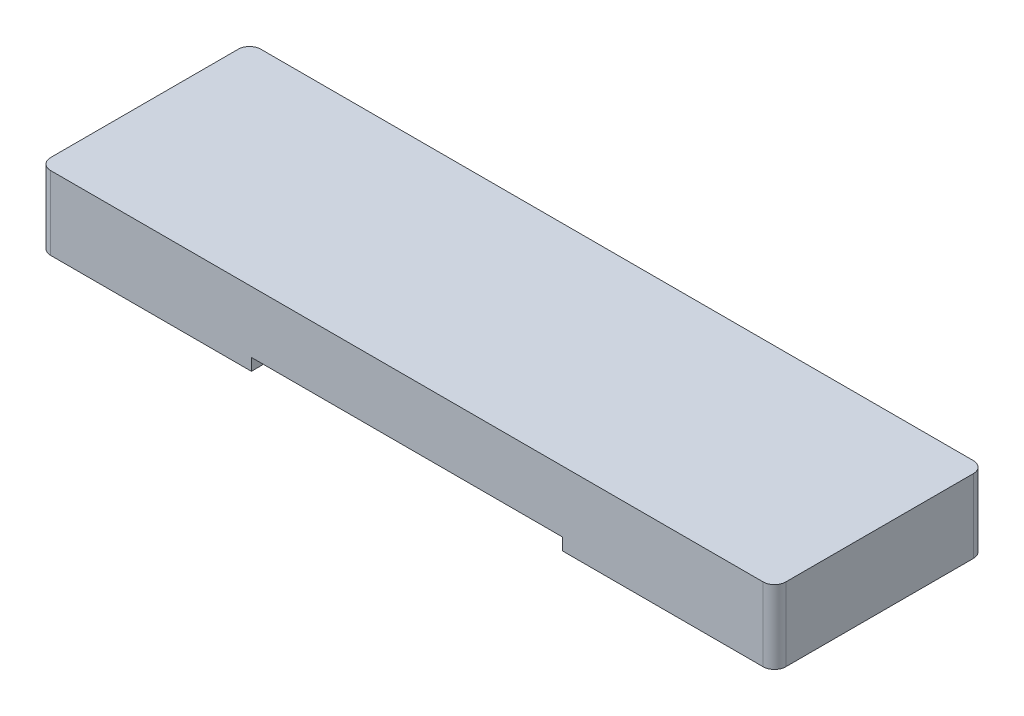
ISO-10303-21;
HEADER;
FILE_DESCRIPTION(('STEP AP214'),'2;1');
FILE_NAME('part.step','',(''),(''),'','','');
FILE_SCHEMA(('AUTOMOTIVE_DESIGN { 1 0 10303 214 1 1 1 1 }'));
ENDSEC;
DATA;
#1=APPLICATION_CONTEXT('core data for automotive mechanical design processes');
#2=APPLICATION_PROTOCOL_DEFINITION('international standard','automotive_design',2000,#1);
#3=PRODUCT_CONTEXT('',#1,'mechanical');
#4=PRODUCT('Part','Part','',(#3));
#5=PRODUCT_RELATED_PRODUCT_CATEGORY('part','',(#4));
#6=PRODUCT_DEFINITION_FORMATION('','',#4);
#7=PRODUCT_DEFINITION_CONTEXT('part definition',#1,'design');
#8=PRODUCT_DEFINITION('design','',#6,#7);
#9=PRODUCT_DEFINITION_SHAPE('','',#8);
#10=(LENGTH_UNIT() NAMED_UNIT(*) SI_UNIT(.MILLI.,.METRE.));
#11=(NAMED_UNIT(*) PLANE_ANGLE_UNIT() SI_UNIT($,.RADIAN.));
#12=(NAMED_UNIT(*) SI_UNIT($,.STERADIAN.) SOLID_ANGLE_UNIT());
#13=UNCERTAINTY_MEASURE_WITH_UNIT(LENGTH_MEASURE(1.E-05),#10,'distance_accuracy_value','');
#14=(GEOMETRIC_REPRESENTATION_CONTEXT(3) GLOBAL_UNCERTAINTY_ASSIGNED_CONTEXT((#13)) GLOBAL_UNIT_ASSIGNED_CONTEXT((#10,
#11,#12)) REPRESENTATION_CONTEXT('',''));
#15=CARTESIAN_POINT('',(0.,0.,0.));
#16=DIRECTION('',(0.,0.,1.));
#17=DIRECTION('',(1.,0.,0.));
#18=AXIS2_PLACEMENT_3D('',#15,#16,#17);
#19=CARTESIAN_POINT('',(0.,0.,-37.17));
#20=DIRECTION('',(0.,-1.,0.));
#21=DIRECTION('',(0.,0.,-1.));
#22=AXIS2_PLACEMENT_3D('',#19,#20,#21);
#23=PLANE('',#22);
#24=DIRECTION('',(0.,0.,1.));
#25=VECTOR('',#24,1.);
#26=CARTESIAN_POINT('',(0.,0.,-37.17));
#27=LINE('',#26,#25);
#28=CARTESIAN_POINT('',(0.,0.,-35.17));
#29=VERTEX_POINT('',#28);
#30=CARTESIAN_POINT('',(0.,0.,-2.));
#31=VERTEX_POINT('',#30);
#32=EDGE_CURVE('E222',#29,#31,#27,.T.);
#33=ORIENTED_EDGE('',*,*,#32,.F.);
#34=CARTESIAN_POINT('',(2.,0.,-35.17));
#35=DIRECTION('',(0.,-1.,0.));
#36=DIRECTION('',(0.,0.,-1.));
#37=AXIS2_PLACEMENT_3D('',#34,#35,#36);
#38=CIRCLE('',#37,2.);
#39=CARTESIAN_POINT('',(2.,0.,-37.17));
#40=VERTEX_POINT('',#39);
#41=EDGE_CURVE('E253',#29,#40,#38,.T.);
#42=ORIENTED_EDGE('',*,*,#41,.T.);
#43=DIRECTION('',(1.,0.,0.));
#44=VECTOR('',#43,1.);
#45=CARTESIAN_POINT('',(0.,0.,-37.17));
#46=LINE('',#45,#44);
#47=CARTESIAN_POINT('',(128.,0.,-37.17));
#48=VERTEX_POINT('',#47);
#49=EDGE_CURVE('E217',#40,#48,#46,.T.);
#50=ORIENTED_EDGE('',*,*,#49,.T.);
#51=CARTESIAN_POINT('',(128.,0.,-35.17));
#52=DIRECTION('',(0.,-1.,0.));
#53=DIRECTION('',(0.,0.,-1.));
#54=AXIS2_PLACEMENT_3D('',#51,#52,#53);
#55=CIRCLE('',#54,2.);
#56=CARTESIAN_POINT('',(130.,0.,-35.17));
#57=VERTEX_POINT('',#56);
#58=EDGE_CURVE('E249',#48,#57,#55,.T.);
#59=ORIENTED_EDGE('',*,*,#58,.T.);
#60=DIRECTION('',(0.,0.,1.));
#61=VECTOR('',#60,1.);
#62=CARTESIAN_POINT('',(130.,0.,-37.17));
#63=LINE('',#62,#61);
#64=CARTESIAN_POINT('',(130.,0.,-2.));
#65=VERTEX_POINT('',#64);
#66=EDGE_CURVE('E231',#57,#65,#63,.T.);
#67=ORIENTED_EDGE('',*,*,#66,.T.);
#68=CARTESIAN_POINT('',(128.,0.,-2.));
#69=DIRECTION('',(0.,-1.,0.));
#70=DIRECTION('',(0.,0.,-1.));
#71=AXIS2_PLACEMENT_3D('',#68,#69,#70);
#72=CIRCLE('',#71,2.);
#73=CARTESIAN_POINT('',(128.,0.,0.));
#74=VERTEX_POINT('',#73);
#75=EDGE_CURVE('E247',#65,#74,#72,.T.);
#76=ORIENTED_EDGE('',*,*,#75,.T.);
#77=DIRECTION('',(1.,0.,0.));
#78=VECTOR('',#77,1.);
#79=CARTESIAN_POINT('',(0.,0.,0.));
#80=LINE('',#79,#78);
#81=CARTESIAN_POINT('',(92.5,0.,0.));
#82=VERTEX_POINT('',#81);
#83=EDGE_CURVE('E163',#82,#74,#80,.T.);
#84=ORIENTED_EDGE('',*,*,#83,.F.);
#85=DIRECTION('',(0.,0.,1.));
#86=VECTOR('',#85,1.);
#87=CARTESIAN_POINT('',(92.5,0.,-5.));
#88=LINE('',#87,#86);
#89=CARTESIAN_POINT('',(92.5,0.,-2.));
#90=VERTEX_POINT('',#89);
#91=EDGE_CURVE('E178',#90,#82,#88,.T.);
#92=ORIENTED_EDGE('',*,*,#91,.F.);
#93=DIRECTION('',(1.,0.,0.));
#94=VECTOR('',#93,1.);
#95=CARTESIAN_POINT('',(0.,0.,-2.));
#96=LINE('',#95,#94);
#97=CARTESIAN_POINT('',(128.,0.,-2.));
#98=VERTEX_POINT('',#97);
#99=EDGE_CURVE('E189',#90,#98,#96,.T.);
#100=ORIENTED_EDGE('',*,*,#99,.T.);
#101=DIRECTION('',(0.,0.,1.));
#102=VECTOR('',#101,1.);
#103=CARTESIAN_POINT('',(128.,0.,-37.17));
#104=LINE('',#103,#102);
#105=CARTESIAN_POINT('',(128.,0.,-35.17));
#106=VERTEX_POINT('',#105);
#107=EDGE_CURVE('E202',#106,#98,#104,.T.);
#108=ORIENTED_EDGE('',*,*,#107,.F.);
#109=DIRECTION('',(1.,0.,0.));
#110=VECTOR('',#109,1.);
#111=CARTESIAN_POINT('',(0.,0.,-35.17));
#112=LINE('',#111,#110);
#113=CARTESIAN_POINT('',(2.,0.,-35.17));
#114=VERTEX_POINT('',#113);
#115=EDGE_CURVE('E196',#114,#106,#112,.T.);
#116=ORIENTED_EDGE('',*,*,#115,.F.);
#117=DIRECTION('',(0.,0.,1.));
#118=VECTOR('',#117,1.);
#119=CARTESIAN_POINT('',(2.,0.,-37.17));
#120=LINE('',#119,#118);
#121=CARTESIAN_POINT('',(2.,0.,-2.));
#122=VERTEX_POINT('',#121);
#123=EDGE_CURVE('E206',#114,#122,#120,.T.);
#124=ORIENTED_EDGE('',*,*,#123,.T.);
#125=CARTESIAN_POINT('',(37.5,0.,-2.));
#126=VERTEX_POINT('',#125);
#127=EDGE_CURVE('E177',#122,#126,#96,.T.);
#128=ORIENTED_EDGE('',*,*,#127,.T.);
#129=DIRECTION('',(0.,0.,1.));
#130=VECTOR('',#129,1.);
#131=CARTESIAN_POINT('',(37.5,0.,-5.));
#132=LINE('',#131,#130);
#133=CARTESIAN_POINT('',(37.5,0.,0.));
#134=VERTEX_POINT('',#133);
#135=EDGE_CURVE('E167',#126,#134,#132,.T.);
#136=ORIENTED_EDGE('',*,*,#135,.T.);
#137=CARTESIAN_POINT('',(2.,0.,0.));
#138=VERTEX_POINT('',#137);
#139=EDGE_CURVE('E152',#138,#134,#80,.T.);
#140=ORIENTED_EDGE('',*,*,#139,.F.);
#141=CARTESIAN_POINT('',(2.,0.,-2.));
#142=DIRECTION('',(0.,-1.,0.));
#143=DIRECTION('',(0.,0.,-1.));
#144=AXIS2_PLACEMENT_3D('',#141,#142,#143);
#145=CIRCLE('',#144,2.);
#146=EDGE_CURVE('E251',#138,#31,#145,.T.);
#147=ORIENTED_EDGE('',*,*,#146,.T.);
#148=EDGE_LOOP('',(#33,#42,#50,#59,#67,#76,#84,#92,#100,#108,#116,#124,#128,#136,#140,#147));
#149=FACE_BOUND('',#148,.T.);
#150=ADVANCED_FACE('F37',(#149),#23,.T.);
#151=CARTESIAN_POINT('',(0.,0.,-37.17));
#152=DIRECTION('',(-1.,0.,0.));
#153=DIRECTION('',(0.,0.,1.));
#154=AXIS2_PLACEMENT_3D('',#151,#152,#153);
#155=PLANE('',#154);
#156=DIRECTION('',(0.,0.,1.));
#157=VECTOR('',#156,1.);
#158=CARTESIAN_POINT('',(0.,13.,-37.17));
#159=LINE('',#158,#157);
#160=CARTESIAN_POINT('',(0.,13.,-35.17));
#161=VERTEX_POINT('',#160);
#162=CARTESIAN_POINT('',(0.,13.,-2.));
#163=VERTEX_POINT('',#162);
#164=EDGE_CURVE('E225',#161,#163,#159,.T.);
#165=ORIENTED_EDGE('',*,*,#164,.F.);
#166=DIRECTION('',(0.,-1.,0.));
#167=VECTOR('',#166,1.);
#168=CARTESIAN_POINT('',(0.,0.,-35.17));
#169=LINE('',#168,#167);
#170=EDGE_CURVE('E244',#161,#29,#169,.T.);
#171=ORIENTED_EDGE('',*,*,#170,.T.);
#172=ORIENTED_EDGE('',*,*,#32,.T.);
#173=DIRECTION('',(0.,-1.,0.));
#174=VECTOR('',#173,1.);
#175=CARTESIAN_POINT('',(0.,13.,-2.));
#176=LINE('',#175,#174);
#177=EDGE_CURVE('E242',#31,#163,#176,.F.);
#178=ORIENTED_EDGE('',*,*,#177,.T.);
#179=EDGE_LOOP('',(#165,#171,#172,#178));
#180=FACE_BOUND('',#179,.T.);
#181=ADVANCED_FACE('F286',(#180),#155,.T.);
#182=CARTESIAN_POINT('',(0.,13.,-37.17));
#183=DIRECTION('',(0.,1.,0.));
#184=DIRECTION('',(0.,0.,1.));
#185=AXIS2_PLACEMENT_3D('',#182,#183,#184);
#186=PLANE('',#185);
#187=DIRECTION('',(-1.,0.,0.));
#188=VECTOR('',#187,1.);
#189=CARTESIAN_POINT('',(0.,13.,-37.17));
#190=LINE('',#189,#188);
#191=CARTESIAN_POINT('',(128.,13.,-37.17));
#192=VERTEX_POINT('',#191);
#193=CARTESIAN_POINT('',(2.,13.,-37.17));
#194=VERTEX_POINT('',#193);
#195=EDGE_CURVE('E220',#192,#194,#190,.T.);
#196=ORIENTED_EDGE('',*,*,#195,.T.);
#197=CARTESIAN_POINT('',(2.,13.,-35.17));
#198=DIRECTION('',(0.,1.,0.));
#199=DIRECTION('',(0.,0.,1.));
#200=AXIS2_PLACEMENT_3D('',#197,#198,#199);
#201=CIRCLE('',#200,2.);
#202=EDGE_CURVE('E263',#194,#161,#201,.T.);
#203=ORIENTED_EDGE('',*,*,#202,.T.);
#204=ORIENTED_EDGE('',*,*,#164,.T.);
#205=CARTESIAN_POINT('',(2.,13.,-2.));
#206=DIRECTION('',(0.,1.,0.));
#207=DIRECTION('',(0.,0.,1.));
#208=AXIS2_PLACEMENT_3D('',#205,#206,#207);
#209=CIRCLE('',#208,2.);
#210=CARTESIAN_POINT('',(2.,13.,0.));
#211=VERTEX_POINT('',#210);
#212=EDGE_CURVE('E261',#163,#211,#209,.T.);
#213=ORIENTED_EDGE('',*,*,#212,.T.);
#214=DIRECTION('',(-1.,0.,0.));
#215=VECTOR('',#214,1.);
#216=CARTESIAN_POINT('',(0.,13.,0.));
#217=LINE('',#216,#215);
#218=CARTESIAN_POINT('',(128.,13.,0.));
#219=VERTEX_POINT('',#218);
#220=EDGE_CURVE('E162',#219,#211,#217,.T.);
#221=ORIENTED_EDGE('',*,*,#220,.F.);
#222=CARTESIAN_POINT('',(128.,13.,-2.));
#223=DIRECTION('',(0.,1.,0.));
#224=DIRECTION('',(0.,0.,1.));
#225=AXIS2_PLACEMENT_3D('',#222,#223,#224);
#226=CIRCLE('',#225,2.);
#227=CARTESIAN_POINT('',(130.,13.,-2.));
#228=VERTEX_POINT('',#227);
#229=EDGE_CURVE('E52',#219,#228,#226,.T.);
#230=ORIENTED_EDGE('',*,*,#229,.T.);
#231=DIRECTION('',(0.,0.,1.));
#232=VECTOR('',#231,1.);
#233=CARTESIAN_POINT('',(130.,13.,-37.17));
#234=LINE('',#233,#232);
#235=CARTESIAN_POINT('',(130.,13.,-35.17));
#236=VERTEX_POINT('',#235);
#237=EDGE_CURVE('E229',#236,#228,#234,.T.);
#238=ORIENTED_EDGE('',*,*,#237,.F.);
#239=CARTESIAN_POINT('',(128.,13.,-35.17));
#240=DIRECTION('',(0.,1.,0.));
#241=DIRECTION('',(0.,0.,1.));
#242=AXIS2_PLACEMENT_3D('',#239,#240,#241);
#243=CIRCLE('',#242,2.);
#244=EDGE_CURVE('E60',#236,#192,#243,.T.);
#245=ORIENTED_EDGE('',*,*,#244,.T.);
#246=EDGE_LOOP('',(#196,#203,#204,#213,#221,#230,#238,#245));
#247=FACE_BOUND('',#246,.T.);
#248=ADVANCED_FACE('F279',(#247),#186,.T.);
#249=CARTESIAN_POINT('',(130.,13.,-37.17));
#250=DIRECTION('',(1.,0.,0.));
#251=DIRECTION('',(0.,0.,-1.));
#252=AXIS2_PLACEMENT_3D('',#249,#250,#251);
#253=PLANE('',#252);
#254=ORIENTED_EDGE('',*,*,#66,.F.);
#255=DIRECTION('',(0.,1.,0.));
#256=VECTOR('',#255,1.);
#257=CARTESIAN_POINT('',(130.,13.,-35.17));
#258=LINE('',#257,#256);
#259=EDGE_CURVE('E11',#57,#236,#258,.T.);
#260=ORIENTED_EDGE('',*,*,#259,.T.);
#261=ORIENTED_EDGE('',*,*,#237,.T.);
#262=DIRECTION('',(0.,1.,0.));
#263=VECTOR('',#262,1.);
#264=CARTESIAN_POINT('',(130.,0.,-2.));
#265=LINE('',#264,#263);
#266=EDGE_CURVE('E45',#228,#65,#265,.F.);
#267=ORIENTED_EDGE('',*,*,#266,.T.);
#268=EDGE_LOOP('',(#254,#260,#261,#267));
#269=FACE_BOUND('',#268,.T.);
#270=ADVANCED_FACE('F271',(#269),#253,.T.);
#271=CARTESIAN_POINT('',(0.,0.,-37.17));
#272=DIRECTION('',(0.,0.,-1.));
#273=DIRECTION('',(-1.,0.,0.));
#274=AXIS2_PLACEMENT_3D('',#271,#272,#273);
#275=PLANE('',#274);
#276=ORIENTED_EDGE('',*,*,#49,.F.);
#277=DIRECTION('',(0.,-1.,0.));
#278=VECTOR('',#277,1.);
#279=CARTESIAN_POINT('',(2.,0.,-37.17));
#280=LINE('',#279,#278);
#281=EDGE_CURVE('E257',#40,#194,#280,.F.);
#282=ORIENTED_EDGE('',*,*,#281,.T.);
#283=ORIENTED_EDGE('',*,*,#195,.F.);
#284=DIRECTION('',(0.,1.,0.));
#285=VECTOR('',#284,1.);
#286=CARTESIAN_POINT('',(128.,0.,-37.17));
#287=LINE('',#286,#285);
#288=EDGE_CURVE('E255',#192,#48,#287,.F.);
#289=ORIENTED_EDGE('',*,*,#288,.T.);
#290=EDGE_LOOP('',(#276,#282,#283,#289));
#291=FACE_BOUND('',#290,.T.);
#292=ADVANCED_FACE('F294',(#291),#275,.T.);
#293=CARTESIAN_POINT('',(0.,0.,0.));
#294=DIRECTION('',(0.,0.,-1.));
#295=DIRECTION('',(-1.,0.,0.));
#296=AXIS2_PLACEMENT_3D('',#293,#294,#295);
#297=PLANE('',#296);
#298=ORIENTED_EDGE('',*,*,#220,.T.);
#299=DIRECTION('',(0.,-1.,0.));
#300=VECTOR('',#299,1.);
#301=CARTESIAN_POINT('',(2.,0.,0.));
#302=LINE('',#301,#300);
#303=EDGE_CURVE('E159',#211,#138,#302,.T.);
#304=ORIENTED_EDGE('',*,*,#303,.T.);
#305=ORIENTED_EDGE('',*,*,#139,.T.);
#306=DIRECTION('',(0.,-1.,0.));
#307=VECTOR('',#306,1.);
#308=CARTESIAN_POINT('',(37.5,0.,0.));
#309=LINE('',#308,#307);
#310=CARTESIAN_POINT('',(37.5,2.13378228,0.));
#311=VERTEX_POINT('',#310);
#312=EDGE_CURVE('E157',#311,#134,#309,.T.);
#313=ORIENTED_EDGE('',*,*,#312,.F.);
#314=DIRECTION('',(-1.,0.,0.));
#315=VECTOR('',#314,1.);
#316=CARTESIAN_POINT('',(37.5,2.13378228,0.));
#317=LINE('',#316,#315);
#318=CARTESIAN_POINT('',(92.5,2.13378228,0.));
#319=VERTEX_POINT('',#318);
#320=EDGE_CURVE('E179',#319,#311,#317,.T.);
#321=ORIENTED_EDGE('',*,*,#320,.F.);
#322=DIRECTION('',(0.,1.,0.));
#323=VECTOR('',#322,1.);
#324=CARTESIAN_POINT('',(92.5,0.,0.));
#325=LINE('',#324,#323);
#326=EDGE_CURVE('E172',#82,#319,#325,.T.);
#327=ORIENTED_EDGE('',*,*,#326,.F.);
#328=ORIENTED_EDGE('',*,*,#83,.T.);
#329=DIRECTION('',(0.,1.,0.));
#330=VECTOR('',#329,1.);
#331=CARTESIAN_POINT('',(128.,13.,0.));
#332=LINE('',#331,#330);
#333=EDGE_CURVE('E265',#74,#219,#332,.T.);
#334=ORIENTED_EDGE('',*,*,#333,.T.);
#335=EDGE_LOOP('',(#298,#304,#305,#313,#321,#327,#328,#334));
#336=FACE_BOUND('',#335,.T.);
#337=ADVANCED_FACE('F155',(#336),#297,.F.);
#338=CARTESIAN_POINT('',(2.,0.,-37.17));
#339=DIRECTION('',(-1.,0.,0.));
#340=DIRECTION('',(0.,0.,1.));
#341=AXIS2_PLACEMENT_3D('',#338,#339,#340);
#342=PLANE('',#341);
#343=DIRECTION('',(0.,-1.,0.));
#344=VECTOR('',#343,1.);
#345=CARTESIAN_POINT('',(2.,0.,-2.));
#346=LINE('',#345,#344);
#347=CARTESIAN_POINT('',(2.,11.,-2.));
#348=VERTEX_POINT('',#347);
#349=EDGE_CURVE('E186',#348,#122,#346,.T.);
#350=ORIENTED_EDGE('',*,*,#349,.T.);
#351=ORIENTED_EDGE('',*,*,#123,.F.);
#352=DIRECTION('',(0.,-1.,0.));
#353=VECTOR('',#352,1.);
#354=CARTESIAN_POINT('',(2.,0.,-35.17));
#355=LINE('',#354,#353);
#356=CARTESIAN_POINT('',(2.,11.,-35.17));
#357=VERTEX_POINT('',#356);
#358=EDGE_CURVE('E193',#357,#114,#355,.T.);
#359=ORIENTED_EDGE('',*,*,#358,.F.);
#360=DIRECTION('',(0.,0.,1.));
#361=VECTOR('',#360,1.);
#362=CARTESIAN_POINT('',(2.,11.,-37.17));
#363=LINE('',#362,#361);
#364=EDGE_CURVE('E190',#357,#348,#363,.T.);
#365=ORIENTED_EDGE('',*,*,#364,.T.);
#366=EDGE_LOOP('',(#350,#351,#359,#365));
#367=FACE_BOUND('',#366,.T.);
#368=ADVANCED_FACE('F329',(#367),#342,.F.);
#369=CARTESIAN_POINT('',(0.,11.,-37.17));
#370=DIRECTION('',(0.,1.,0.));
#371=DIRECTION('',(0.,0.,1.));
#372=AXIS2_PLACEMENT_3D('',#369,#370,#371);
#373=PLANE('',#372);
#374=DIRECTION('',(-1.,0.,0.));
#375=VECTOR('',#374,1.);
#376=CARTESIAN_POINT('',(0.,11.,-2.));
#377=LINE('',#376,#375);
#378=CARTESIAN_POINT('',(128.,11.,-2.));
#379=VERTEX_POINT('',#378);
#380=EDGE_CURVE('E197',#379,#348,#377,.T.);
#381=ORIENTED_EDGE('',*,*,#380,.T.);
#382=ORIENTED_EDGE('',*,*,#364,.F.);
#383=DIRECTION('',(-1.,0.,0.));
#384=VECTOR('',#383,1.);
#385=CARTESIAN_POINT('',(0.,11.,-35.17));
#386=LINE('',#385,#384);
#387=CARTESIAN_POINT('',(128.,11.,-35.17));
#388=VERTEX_POINT('',#387);
#389=EDGE_CURVE('E203',#388,#357,#386,.T.);
#390=ORIENTED_EDGE('',*,*,#389,.F.);
#391=DIRECTION('',(0.,0.,1.));
#392=VECTOR('',#391,1.);
#393=CARTESIAN_POINT('',(128.,11.,-37.17));
#394=LINE('',#393,#392);
#395=EDGE_CURVE('E192',#388,#379,#394,.T.);
#396=ORIENTED_EDGE('',*,*,#395,.T.);
#397=EDGE_LOOP('',(#381,#382,#390,#396));
#398=FACE_BOUND('',#397,.T.);
#399=ADVANCED_FACE('F332',(#398),#373,.F.);
#400=CARTESIAN_POINT('',(128.,13.,-37.17));
#401=DIRECTION('',(1.,0.,0.));
#402=DIRECTION('',(0.,0.,-1.));
#403=AXIS2_PLACEMENT_3D('',#400,#401,#402);
#404=PLANE('',#403);
#405=DIRECTION('',(0.,1.,0.));
#406=VECTOR('',#405,1.);
#407=CARTESIAN_POINT('',(128.,13.,-2.));
#408=LINE('',#407,#406);
#409=EDGE_CURVE('E200',#98,#379,#408,.T.);
#410=ORIENTED_EDGE('',*,*,#409,.T.);
#411=ORIENTED_EDGE('',*,*,#395,.F.);
#412=DIRECTION('',(0.,1.,0.));
#413=VECTOR('',#412,1.);
#414=CARTESIAN_POINT('',(128.,13.,-35.17));
#415=LINE('',#414,#413);
#416=EDGE_CURVE('E207',#106,#388,#415,.T.);
#417=ORIENTED_EDGE('',*,*,#416,.F.);
#418=ORIENTED_EDGE('',*,*,#107,.T.);
#419=EDGE_LOOP('',(#410,#411,#417,#418));
#420=FACE_BOUND('',#419,.T.);
#421=ADVANCED_FACE('F336',(#420),#404,.F.);
#422=CARTESIAN_POINT('',(0.,0.,-35.17));
#423=DIRECTION('',(0.,0.,-1.));
#424=DIRECTION('',(-1.,0.,0.));
#425=AXIS2_PLACEMENT_3D('',#422,#423,#424);
#426=PLANE('',#425);
#427=ORIENTED_EDGE('',*,*,#358,.T.);
#428=ORIENTED_EDGE('',*,*,#115,.T.);
#429=ORIENTED_EDGE('',*,*,#416,.T.);
#430=ORIENTED_EDGE('',*,*,#389,.T.);
#431=EDGE_LOOP('',(#427,#428,#429,#430));
#432=FACE_BOUND('',#431,.T.);
#433=ADVANCED_FACE('F340',(#432),#426,.F.);
#434=CARTESIAN_POINT('',(0.,0.,-2.));
#435=DIRECTION('',(0.,0.,-1.));
#436=DIRECTION('',(-1.,0.,0.));
#437=AXIS2_PLACEMENT_3D('',#434,#435,#436);
#438=PLANE('',#437);
#439=DIRECTION('',(0.,1.,0.));
#440=VECTOR('',#439,1.);
#441=CARTESIAN_POINT('',(37.5,0.,-2.));
#442=LINE('',#441,#440);
#443=CARTESIAN_POINT('',(37.5,2.13378228,-2.));
#444=VERTEX_POINT('',#443);
#445=EDGE_CURVE('E240',#126,#444,#442,.T.);
#446=ORIENTED_EDGE('',*,*,#445,.F.);
#447=ORIENTED_EDGE('',*,*,#127,.F.);
#448=ORIENTED_EDGE('',*,*,#349,.F.);
#449=ORIENTED_EDGE('',*,*,#380,.F.);
#450=ORIENTED_EDGE('',*,*,#409,.F.);
#451=ORIENTED_EDGE('',*,*,#99,.F.);
#452=DIRECTION('',(0.,-1.,0.));
#453=VECTOR('',#452,1.);
#454=CARTESIAN_POINT('',(92.5,0.,-2.));
#455=LINE('',#454,#453);
#456=CARTESIAN_POINT('',(92.5,2.13378228,-2.));
#457=VERTEX_POINT('',#456);
#458=EDGE_CURVE('E228',#457,#90,#455,.T.);
#459=ORIENTED_EDGE('',*,*,#458,.F.);
#460=DIRECTION('',(1.,0.,0.));
#461=VECTOR('',#460,1.);
#462=CARTESIAN_POINT('',(0.,2.13378228,-2.));
#463=LINE('',#462,#461);
#464=EDGE_CURVE('E237',#444,#457,#463,.T.);
#465=ORIENTED_EDGE('',*,*,#464,.F.);
#466=EDGE_LOOP('',(#446,#447,#448,#449,#450,#451,#459,#465));
#467=FACE_BOUND('',#466,.T.);
#468=ADVANCED_FACE('F328',(#467),#438,.T.);
#469=CARTESIAN_POINT('',(37.5,0.,-5.));
#470=DIRECTION('',(-1.,0.,0.));
#471=DIRECTION('',(0.,0.,1.));
#472=AXIS2_PLACEMENT_3D('',#469,#470,#471);
#473=PLANE('',#472);
#474=ORIENTED_EDGE('',*,*,#445,.T.);
#475=DIRECTION('',(0.,0.,1.));
#476=VECTOR('',#475,1.);
#477=CARTESIAN_POINT('',(37.5,2.13378228,-5.));
#478=LINE('',#477,#476);
#479=EDGE_CURVE('E170',#444,#311,#478,.T.);
#480=ORIENTED_EDGE('',*,*,#479,.T.);
#481=ORIENTED_EDGE('',*,*,#312,.T.);
#482=ORIENTED_EDGE('',*,*,#135,.F.);
#483=EDGE_LOOP('',(#474,#480,#481,#482));
#484=FACE_BOUND('',#483,.T.);
#485=ADVANCED_FACE('F166',(#484),#473,.F.);
#486=CARTESIAN_POINT('',(37.5,2.13378228,-5.));
#487=DIRECTION('',(0.,1.,0.));
#488=DIRECTION('',(0.,0.,1.));
#489=AXIS2_PLACEMENT_3D('',#486,#487,#488);
#490=PLANE('',#489);
#491=ORIENTED_EDGE('',*,*,#464,.T.);
#492=DIRECTION('',(0.,0.,1.));
#493=VECTOR('',#492,1.);
#494=CARTESIAN_POINT('',(92.5,2.13378228,-5.));
#495=LINE('',#494,#493);
#496=EDGE_CURVE('E181',#457,#319,#495,.T.);
#497=ORIENTED_EDGE('',*,*,#496,.T.);
#498=ORIENTED_EDGE('',*,*,#320,.T.);
#499=ORIENTED_EDGE('',*,*,#479,.F.);
#500=EDGE_LOOP('',(#491,#497,#498,#499));
#501=FACE_BOUND('',#500,.T.);
#502=ADVANCED_FACE('F318',(#501),#490,.F.);
#503=CARTESIAN_POINT('',(92.5,0.,-5.));
#504=DIRECTION('',(1.,0.,0.));
#505=DIRECTION('',(0.,0.,-1.));
#506=AXIS2_PLACEMENT_3D('',#503,#504,#505);
#507=PLANE('',#506);
#508=ORIENTED_EDGE('',*,*,#458,.T.);
#509=ORIENTED_EDGE('',*,*,#91,.T.);
#510=ORIENTED_EDGE('',*,*,#326,.T.);
#511=ORIENTED_EDGE('',*,*,#496,.F.);
#512=EDGE_LOOP('',(#508,#509,#510,#511));
#513=FACE_BOUND('',#512,.T.);
#514=ADVANCED_FACE('F314',(#513),#507,.F.);
#515=CARTESIAN_POINT('',(2.,0.,-35.17));
#516=DIRECTION('',(0.,-1.,0.));
#517=DIRECTION('',(0.,0.,-1.));
#518=AXIS2_PLACEMENT_3D('',#515,#516,#517);
#519=CYLINDRICAL_SURFACE('',#518,2.);
#520=ORIENTED_EDGE('',*,*,#202,.F.);
#521=ORIENTED_EDGE('',*,*,#281,.F.);
#522=ORIENTED_EDGE('',*,*,#41,.F.);
#523=ORIENTED_EDGE('',*,*,#170,.F.);
#524=EDGE_LOOP('',(#520,#521,#522,#523));
#525=FACE_BOUND('',#524,.T.);
#526=ADVANCED_FACE('F290',(#525),#519,.T.);
#527=CARTESIAN_POINT('',(2.,0.,-2.));
#528=DIRECTION('',(0.,1.,0.));
#529=DIRECTION('',(0.,0.,1.));
#530=AXIS2_PLACEMENT_3D('',#527,#528,#529);
#531=CYLINDRICAL_SURFACE('',#530,2.);
#532=ORIENTED_EDGE('',*,*,#212,.F.);
#533=ORIENTED_EDGE('',*,*,#177,.F.);
#534=ORIENTED_EDGE('',*,*,#146,.F.);
#535=ORIENTED_EDGE('',*,*,#303,.F.);
#536=EDGE_LOOP('',(#532,#533,#534,#535));
#537=FACE_BOUND('',#536,.T.);
#538=ADVANCED_FACE('F284',(#537),#531,.T.);
#539=CARTESIAN_POINT('',(128.,13.,-35.17));
#540=DIRECTION('',(0.,1.,0.));
#541=DIRECTION('',(0.,0.,1.));
#542=AXIS2_PLACEMENT_3D('',#539,#540,#541);
#543=CYLINDRICAL_SURFACE('',#542,2.);
#544=ORIENTED_EDGE('',*,*,#58,.F.);
#545=ORIENTED_EDGE('',*,*,#288,.F.);
#546=ORIENTED_EDGE('',*,*,#244,.F.);
#547=ORIENTED_EDGE('',*,*,#259,.F.);
#548=EDGE_LOOP('',(#544,#545,#546,#547));
#549=FACE_BOUND('',#548,.T.);
#550=ADVANCED_FACE('F296',(#549),#543,.T.);
#551=CARTESIAN_POINT('',(128.,0.,-2.));
#552=DIRECTION('',(0.,-1.,0.));
#553=DIRECTION('',(0.,0.,-1.));
#554=AXIS2_PLACEMENT_3D('',#551,#552,#553);
#555=CYLINDRICAL_SURFACE('',#554,2.);
#556=ORIENTED_EDGE('',*,*,#75,.F.);
#557=ORIENTED_EDGE('',*,*,#266,.F.);
#558=ORIENTED_EDGE('',*,*,#229,.F.);
#559=ORIENTED_EDGE('',*,*,#333,.F.);
#560=EDGE_LOOP('',(#556,#557,#558,#559));
#561=FACE_BOUND('',#560,.T.);
#562=ADVANCED_FACE('F39',(#561),#555,.T.);
#563=CLOSED_SHELL('',(#150,#181,#248,#270,#292,#337,#368,#399,#421,#433,#468,#485,#502,#514,
#526,#538,#550,#562));
#564=MANIFOLD_SOLID_BREP('B2',#563);
#565=ADVANCED_BREP_SHAPE_REPRESENTATION('',(#18,#564),#14);
#566=SHAPE_DEFINITION_REPRESENTATION(#9,#565);
ENDSEC;
END-ISO-10303-21;
